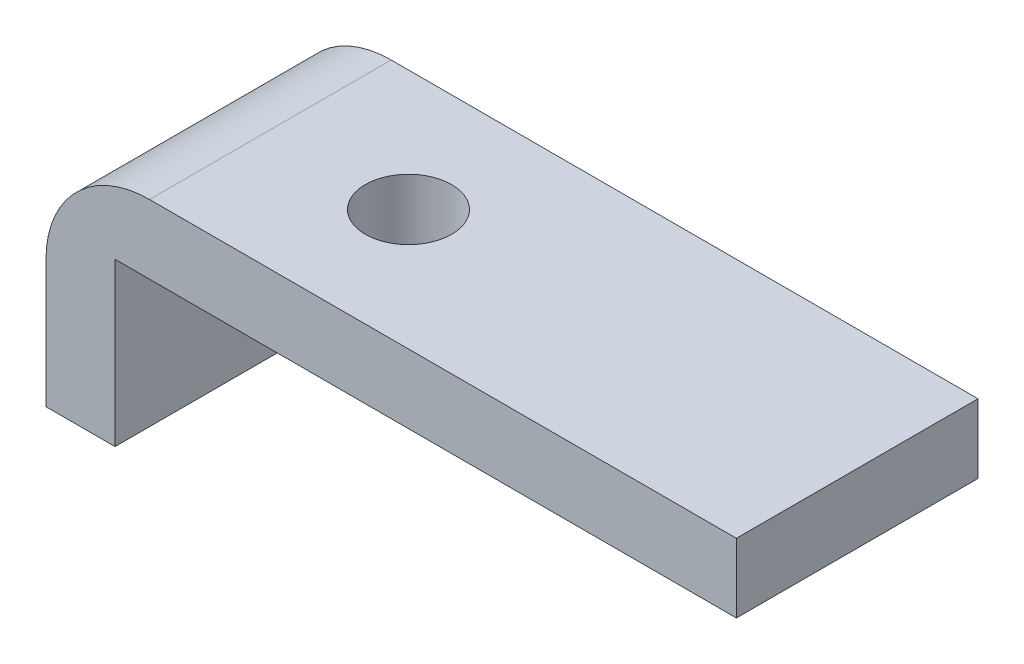
ISO-10303-21;
HEADER;
FILE_DESCRIPTION(('STEP AP214'),'2;1');
FILE_NAME('part.step','',(''),(''),'','','');
FILE_SCHEMA(('AUTOMOTIVE_DESIGN { 1 0 10303 214 1 1 1 1 }'));
ENDSEC;
DATA;
#1=APPLICATION_CONTEXT('core data for automotive mechanical design processes');
#2=APPLICATION_PROTOCOL_DEFINITION('international standard','automotive_design',2000,#1);
#3=PRODUCT_CONTEXT('',#1,'mechanical');
#4=PRODUCT('Part','Part','',(#3));
#5=PRODUCT_RELATED_PRODUCT_CATEGORY('part','',(#4));
#6=PRODUCT_DEFINITION_FORMATION('','',#4);
#7=PRODUCT_DEFINITION_CONTEXT('part definition',#1,'design');
#8=PRODUCT_DEFINITION('design','',#6,#7);
#9=PRODUCT_DEFINITION_SHAPE('','',#8);
#10=(LENGTH_UNIT() NAMED_UNIT(*) SI_UNIT(.MILLI.,.METRE.));
#11=(NAMED_UNIT(*) PLANE_ANGLE_UNIT() SI_UNIT($,.RADIAN.));
#12=(NAMED_UNIT(*) SI_UNIT($,.STERADIAN.) SOLID_ANGLE_UNIT());
#13=UNCERTAINTY_MEASURE_WITH_UNIT(LENGTH_MEASURE(1.E-05),#10,'distance_accuracy_value','');
#14=(GEOMETRIC_REPRESENTATION_CONTEXT(3) GLOBAL_UNCERTAINTY_ASSIGNED_CONTEXT((#13)) GLOBAL_UNIT_ASSIGNED_CONTEXT((#10,
#11,#12)) REPRESENTATION_CONTEXT('',''));
#15=CARTESIAN_POINT('',(0.,0.,0.));
#16=DIRECTION('',(0.,0.,1.));
#17=DIRECTION('',(1.,0.,0.));
#18=AXIS2_PLACEMENT_3D('',#15,#16,#17);
#19=CARTESIAN_POINT('',(8.5,-2.,3.5));
#20=DIRECTION('',(-1.,0.,0.));
#21=DIRECTION('',(0.,-1.,0.));
#22=AXIS2_PLACEMENT_3D('',#19,#20,#21);
#23=PLANE('',#22);
#24=DIRECTION('',(0.,1.,0.));
#25=VECTOR('',#24,1.);
#26=CARTESIAN_POINT('',(8.5,-2.,-3.5));
#27=LINE('',#26,#25);
#28=CARTESIAN_POINT('',(8.5,-2.,-3.5));
#29=VERTEX_POINT('',#28);
#30=CARTESIAN_POINT('',(8.5,0.,-3.5));
#31=VERTEX_POINT('',#30);
#32=EDGE_CURVE('E127',#29,#31,#27,.T.);
#33=ORIENTED_EDGE('',*,*,#32,.T.);
#34=DIRECTION('',(0.,0.,-1.));
#35=VECTOR('',#34,1.);
#36=CARTESIAN_POINT('',(8.5,0.,3.5));
#37=LINE('',#36,#35);
#38=CARTESIAN_POINT('',(8.5,0.,3.5));
#39=VERTEX_POINT('',#38);
#40=EDGE_CURVE('E11',#39,#31,#37,.T.);
#41=ORIENTED_EDGE('',*,*,#40,.F.);
#42=DIRECTION('',(0.,1.,0.));
#43=VECTOR('',#42,1.);
#44=CARTESIAN_POINT('',(8.5,-2.,3.5));
#45=LINE('',#44,#43);
#46=CARTESIAN_POINT('',(8.5,-2.,3.5));
#47=VERTEX_POINT('',#46);
#48=EDGE_CURVE('E140',#47,#39,#45,.T.);
#49=ORIENTED_EDGE('',*,*,#48,.F.);
#50=DIRECTION('',(0.,0.,-1.));
#51=VECTOR('',#50,1.);
#52=CARTESIAN_POINT('',(8.5,-2.,3.5));
#53=LINE('',#52,#51);
#54=EDGE_CURVE('E123',#47,#29,#53,.T.);
#55=ORIENTED_EDGE('',*,*,#54,.T.);
#56=EDGE_LOOP('',(#33,#41,#49,#55));
#57=FACE_BOUND('',#56,.T.);
#58=ADVANCED_FACE('F37',(#57),#23,.F.);
#59=CARTESIAN_POINT('',(8.5,0.,3.5));
#60=DIRECTION('',(0.,-1.,0.));
#61=DIRECTION('',(1.,0.,0.));
#62=AXIS2_PLACEMENT_3D('',#59,#60,#61);
#63=PLANE('',#62);
#64=CARTESIAN_POINT('',(-4.5,0.,0.));
#65=DIRECTION('',(0.,-1.,0.));
#66=DIRECTION('',(0.,0.,-1.));
#67=AXIS2_PLACEMENT_3D('',#64,#65,#66);
#68=CIRCLE('',#67,1.25);
#69=CARTESIAN_POINT('',(-4.5,0.,-1.25));
#70=VERTEX_POINT('',#69);
#71=EDGE_CURVE('E131',#70,#70,#68,.T.);
#72=ORIENTED_EDGE('',*,*,#71,.T.);
#73=EDGE_LOOP('',(#72));
#74=FACE_BOUND('',#73,.T.);
#75=DIRECTION('',(-1.,0.,0.));
#76=VECTOR('',#75,1.);
#77=CARTESIAN_POINT('',(8.5,0.,-3.5));
#78=LINE('',#77,#76);
#79=CARTESIAN_POINT('',(-8.5,0.,-3.5));
#80=VERTEX_POINT('',#79);
#81=EDGE_CURVE('E130',#31,#80,#78,.T.);
#82=ORIENTED_EDGE('',*,*,#81,.T.);
#83=DIRECTION('',(0.,0.,-1.));
#84=VECTOR('',#83,1.);
#85=CARTESIAN_POINT('',(-8.5,0.,3.5));
#86=LINE('',#85,#84);
#87=CARTESIAN_POINT('',(-8.5,0.,3.5));
#88=VERTEX_POINT('',#87);
#89=EDGE_CURVE('E45',#88,#80,#86,.T.);
#90=ORIENTED_EDGE('',*,*,#89,.F.);
#91=DIRECTION('',(-1.,0.,0.));
#92=VECTOR('',#91,1.);
#93=CARTESIAN_POINT('',(8.5,0.,3.5));
#94=LINE('',#93,#92);
#95=EDGE_CURVE('E93',#39,#88,#94,.T.);
#96=ORIENTED_EDGE('',*,*,#95,.F.);
#97=ORIENTED_EDGE('',*,*,#40,.T.);
#98=EDGE_LOOP('',(#82,#90,#96,#97));
#99=FACE_BOUND('',#98,.T.);
#100=ADVANCED_FACE('F182',(#74,#99),#63,.F.);
#101=CARTESIAN_POINT('',(-8.5,-3.,3.5));
#102=DIRECTION('',(0.,0.,-1.));
#103=DIRECTION('',(-1.,0.,0.));
#104=AXIS2_PLACEMENT_3D('',#101,#102,#103);
#105=CYLINDRICAL_SURFACE('',#104,3.);
#106=CARTESIAN_POINT('',(-8.5,-3.,-3.5));
#107=DIRECTION('',(0.,0.,1.));
#108=DIRECTION('',(1.,0.,0.));
#109=AXIS2_PLACEMENT_3D('',#106,#107,#108);
#110=CIRCLE('',#109,3.);
#111=CARTESIAN_POINT('',(-11.5,-3.,-3.5));
#112=VERTEX_POINT('',#111);
#113=EDGE_CURVE('E133',#80,#112,#110,.T.);
#114=ORIENTED_EDGE('',*,*,#113,.T.);
#115=DIRECTION('',(0.,0.,-1.));
#116=VECTOR('',#115,1.);
#117=CARTESIAN_POINT('',(-11.5,-3.,3.5));
#118=LINE('',#117,#116);
#119=CARTESIAN_POINT('',(-11.5,-3.,3.5));
#120=VERTEX_POINT('',#119);
#121=EDGE_CURVE('E144',#120,#112,#118,.T.);
#122=ORIENTED_EDGE('',*,*,#121,.F.);
#123=CARTESIAN_POINT('',(-8.5,-3.,3.5));
#124=DIRECTION('',(0.,0.,1.));
#125=DIRECTION('',(1.,0.,0.));
#126=AXIS2_PLACEMENT_3D('',#123,#124,#125);
#127=CIRCLE('',#126,3.);
#128=EDGE_CURVE('E152',#88,#120,#127,.T.);
#129=ORIENTED_EDGE('',*,*,#128,.F.);
#130=ORIENTED_EDGE('',*,*,#89,.T.);
#131=EDGE_LOOP('',(#114,#122,#129,#130));
#132=FACE_BOUND('',#131,.T.);
#133=ADVANCED_FACE('F150',(#132),#105,.T.);
#134=CARTESIAN_POINT('',(-11.5,-3.,3.5));
#135=DIRECTION('',(1.,0.,0.));
#136=DIRECTION('',(0.,1.,0.));
#137=AXIS2_PLACEMENT_3D('',#134,#135,#136);
#138=PLANE('',#137);
#139=DIRECTION('',(0.,-1.,0.));
#140=VECTOR('',#139,1.);
#141=CARTESIAN_POINT('',(-11.5,-3.,-3.5));
#142=LINE('',#141,#140);
#143=CARTESIAN_POINT('',(-11.5,-6.7,-3.5));
#144=VERTEX_POINT('',#143);
#145=EDGE_CURVE('E135',#112,#144,#142,.T.);
#146=ORIENTED_EDGE('',*,*,#145,.T.);
#147=DIRECTION('',(0.,0.,-1.));
#148=VECTOR('',#147,1.);
#149=CARTESIAN_POINT('',(-11.5,-6.7,3.5));
#150=LINE('',#149,#148);
#151=CARTESIAN_POINT('',(-11.5,-6.7,3.5));
#152=VERTEX_POINT('',#151);
#153=EDGE_CURVE('E118',#152,#144,#150,.T.);
#154=ORIENTED_EDGE('',*,*,#153,.F.);
#155=DIRECTION('',(0.,-1.,0.));
#156=VECTOR('',#155,1.);
#157=CARTESIAN_POINT('',(-11.5,-3.,3.5));
#158=LINE('',#157,#156);
#159=EDGE_CURVE('E109',#120,#152,#158,.T.);
#160=ORIENTED_EDGE('',*,*,#159,.F.);
#161=ORIENTED_EDGE('',*,*,#121,.T.);
#162=EDGE_LOOP('',(#146,#154,#160,#161));
#163=FACE_BOUND('',#162,.T.);
#164=ADVANCED_FACE('F158',(#163),#138,.F.);
#165=CARTESIAN_POINT('',(-11.5,-6.7,3.5));
#166=DIRECTION('',(0.,1.,0.));
#167=DIRECTION('',(0.,0.,1.));
#168=AXIS2_PLACEMENT_3D('',#165,#166,#167);
#169=PLANE('',#168);
#170=DIRECTION('',(1.,0.,0.));
#171=VECTOR('',#170,1.);
#172=CARTESIAN_POINT('',(-11.5,-6.7,-3.5));
#173=LINE('',#172,#171);
#174=CARTESIAN_POINT('',(-9.5,-6.7,-3.5));
#175=VERTEX_POINT('',#174);
#176=EDGE_CURVE('E117',#144,#175,#173,.T.);
#177=ORIENTED_EDGE('',*,*,#176,.T.);
#178=DIRECTION('',(0.,0.,-1.));
#179=VECTOR('',#178,1.);
#180=CARTESIAN_POINT('',(-9.5,-6.7,3.5));
#181=LINE('',#180,#179);
#182=CARTESIAN_POINT('',(-9.5,-6.7,3.5));
#183=VERTEX_POINT('',#182);
#184=EDGE_CURVE('E114',#183,#175,#181,.T.);
#185=ORIENTED_EDGE('',*,*,#184,.F.);
#186=DIRECTION('',(1.,0.,0.));
#187=VECTOR('',#186,1.);
#188=CARTESIAN_POINT('',(-11.5,-6.7,3.5));
#189=LINE('',#188,#187);
#190=EDGE_CURVE('E103',#152,#183,#189,.T.);
#191=ORIENTED_EDGE('',*,*,#190,.F.);
#192=ORIENTED_EDGE('',*,*,#153,.T.);
#193=EDGE_LOOP('',(#177,#185,#191,#192));
#194=FACE_BOUND('',#193,.T.);
#195=ADVANCED_FACE('F115',(#194),#169,.F.);
#196=CARTESIAN_POINT('',(-9.5,-6.7,3.5));
#197=DIRECTION('',(-1.,0.,0.));
#198=DIRECTION('',(0.,-1.,0.));
#199=AXIS2_PLACEMENT_3D('',#196,#197,#198);
#200=PLANE('',#199);
#201=DIRECTION('',(0.,1.,0.));
#202=VECTOR('',#201,1.);
#203=CARTESIAN_POINT('',(-9.5,-6.7,-3.5));
#204=LINE('',#203,#202);
#205=CARTESIAN_POINT('',(-9.5,-2.,-3.5));
#206=VERTEX_POINT('',#205);
#207=EDGE_CURVE('E79',#175,#206,#204,.T.);
#208=ORIENTED_EDGE('',*,*,#207,.T.);
#209=DIRECTION('',(0.,0.,-1.));
#210=VECTOR('',#209,1.);
#211=CARTESIAN_POINT('',(-9.5,-2.,3.5));
#212=LINE('',#211,#210);
#213=CARTESIAN_POINT('',(-9.5,-2.,3.5));
#214=VERTEX_POINT('',#213);
#215=EDGE_CURVE('E119',#214,#206,#212,.T.);
#216=ORIENTED_EDGE('',*,*,#215,.F.);
#217=DIRECTION('',(0.,1.,0.));
#218=VECTOR('',#217,1.);
#219=CARTESIAN_POINT('',(-9.5,-6.7,3.5));
#220=LINE('',#219,#218);
#221=EDGE_CURVE('E107',#183,#214,#220,.T.);
#222=ORIENTED_EDGE('',*,*,#221,.F.);
#223=ORIENTED_EDGE('',*,*,#184,.T.);
#224=EDGE_LOOP('',(#208,#216,#222,#223));
#225=FACE_BOUND('',#224,.T.);
#226=ADVANCED_FACE('F121',(#225),#200,.F.);
#227=CARTESIAN_POINT('',(-9.5,-2.,3.5));
#228=DIRECTION('',(0.,1.,0.));
#229=DIRECTION('',(0.,0.,1.));
#230=AXIS2_PLACEMENT_3D('',#227,#228,#229);
#231=PLANE('',#230);
#232=CARTESIAN_POINT('',(-4.5,-2.,0.));
#233=DIRECTION('',(0.,-1.,0.));
#234=DIRECTION('',(0.,0.,-1.));
#235=AXIS2_PLACEMENT_3D('',#232,#233,#234);
#236=CIRCLE('',#235,1.24999999999999);
#237=CARTESIAN_POINT('',(-4.5,-2.,-1.24999999999999));
#238=VERTEX_POINT('',#237);
#239=EDGE_CURVE('E165',#238,#238,#236,.T.);
#240=ORIENTED_EDGE('',*,*,#239,.F.);
#241=EDGE_LOOP('',(#240));
#242=FACE_BOUND('',#241,.T.);
#243=DIRECTION('',(1.,0.,0.));
#244=VECTOR('',#243,1.);
#245=CARTESIAN_POINT('',(-9.5,-2.,-3.5));
#246=LINE('',#245,#244);
#247=EDGE_CURVE('E85',#206,#29,#246,.T.);
#248=ORIENTED_EDGE('',*,*,#247,.T.);
#249=ORIENTED_EDGE('',*,*,#54,.F.);
#250=DIRECTION('',(1.,0.,0.));
#251=VECTOR('',#250,1.);
#252=CARTESIAN_POINT('',(-9.5,-2.,3.5));
#253=LINE('',#252,#251);
#254=EDGE_CURVE('E53',#214,#47,#253,.T.);
#255=ORIENTED_EDGE('',*,*,#254,.F.);
#256=ORIENTED_EDGE('',*,*,#215,.T.);
#257=EDGE_LOOP('',(#248,#249,#255,#256));
#258=FACE_BOUND('',#257,.T.);
#259=ADVANCED_FACE('F171',(#242,#258),#231,.F.);
#260=CARTESIAN_POINT('',(-8.5,-3.,3.5));
#261=DIRECTION('',(0.,0.,1.));
#262=DIRECTION('',(1.,0.,0.));
#263=AXIS2_PLACEMENT_3D('',#260,#261,#262);
#264=PLANE('',#263);
#265=ORIENTED_EDGE('',*,*,#48,.T.);
#266=ORIENTED_EDGE('',*,*,#95,.T.);
#267=ORIENTED_EDGE('',*,*,#128,.T.);
#268=ORIENTED_EDGE('',*,*,#159,.T.);
#269=ORIENTED_EDGE('',*,*,#190,.T.);
#270=ORIENTED_EDGE('',*,*,#221,.T.);
#271=ORIENTED_EDGE('',*,*,#254,.T.);
#272=EDGE_LOOP('',(#265,#266,#267,#268,#269,#270,#271));
#273=FACE_BOUND('',#272,.T.);
#274=ADVANCED_FACE('F105',(#273),#264,.T.);
#275=CARTESIAN_POINT('',(-8.5,-3.,-3.5));
#276=DIRECTION('',(0.,0.,1.));
#277=DIRECTION('',(1.,0.,0.));
#278=AXIS2_PLACEMENT_3D('',#275,#276,#277);
#279=PLANE('',#278);
#280=ORIENTED_EDGE('',*,*,#32,.F.);
#281=ORIENTED_EDGE('',*,*,#247,.F.);
#282=ORIENTED_EDGE('',*,*,#207,.F.);
#283=ORIENTED_EDGE('',*,*,#176,.F.);
#284=ORIENTED_EDGE('',*,*,#145,.F.);
#285=ORIENTED_EDGE('',*,*,#113,.F.);
#286=ORIENTED_EDGE('',*,*,#81,.F.);
#287=EDGE_LOOP('',(#280,#281,#282,#283,#284,#285,#286));
#288=FACE_BOUND('',#287,.T.);
#289=ADVANCED_FACE('F156',(#288),#279,.F.);
#290=CARTESIAN_POINT('',(-4.5,-2.,0.));
#291=DIRECTION('',(0.,-1.,0.));
#292=DIRECTION('',(0.,0.,-1.));
#293=AXIS2_PLACEMENT_3D('',#290,#291,#292);
#294=CYLINDRICAL_SURFACE('',#293,1.24999999999999);
#295=ORIENTED_EDGE('',*,*,#71,.F.);
#296=EDGE_LOOP('',(#295));
#297=FACE_BOUND('',#296,.T.);
#298=ORIENTED_EDGE('',*,*,#239,.T.);
#299=EDGE_LOOP('',(#298));
#300=FACE_BOUND('',#299,.T.);
#301=ADVANCED_FACE('F169',(#297,#300),#294,.F.);
#302=CLOSED_SHELL('',(#58,#100,#133,#164,#195,#226,#259,#274,#289,#301));
#303=MANIFOLD_SOLID_BREP('B2',#302);
#304=ADVANCED_BREP_SHAPE_REPRESENTATION('',(#18,#303),#14);
#305=SHAPE_DEFINITION_REPRESENTATION(#9,#304);
ENDSEC;
END-ISO-10303-21;
